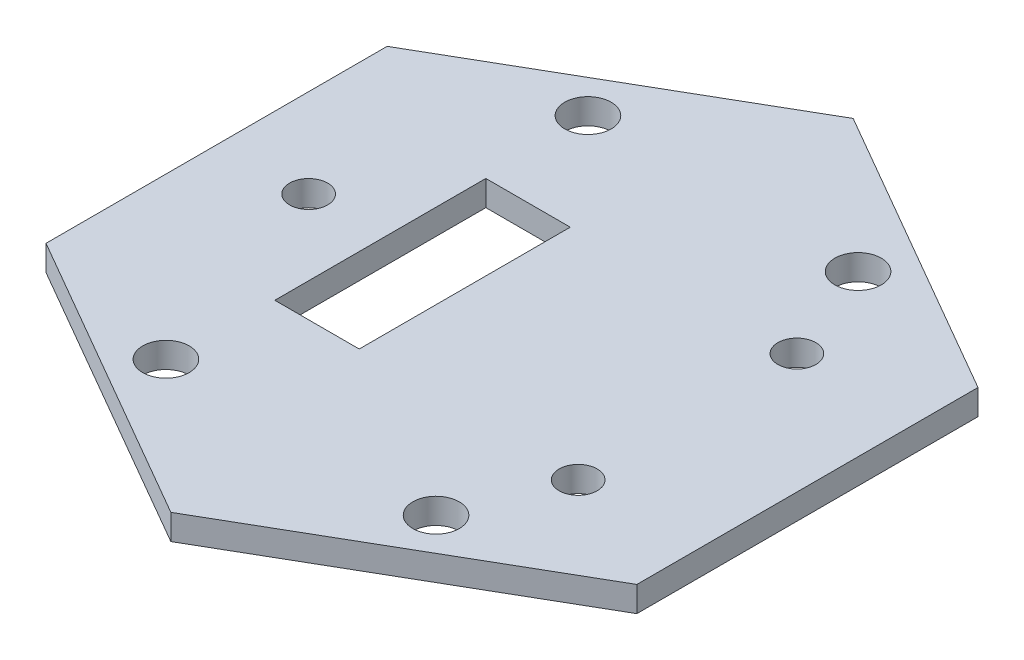
ISO-10303-21;
HEADER;
FILE_DESCRIPTION(('STEP AP214'),'2;1');
FILE_NAME('part.step','',(''),(''),'','','');
FILE_SCHEMA(('AUTOMOTIVE_DESIGN { 1 0 10303 214 1 1 1 1 }'));
ENDSEC;
DATA;
#1=APPLICATION_CONTEXT('core data for automotive mechanical design processes');
#2=APPLICATION_PROTOCOL_DEFINITION('international standard','automotive_design',2000,#1);
#3=PRODUCT_CONTEXT('',#1,'mechanical');
#4=PRODUCT('Part','Part','',(#3));
#5=PRODUCT_RELATED_PRODUCT_CATEGORY('part','',(#4));
#6=PRODUCT_DEFINITION_FORMATION('','',#4);
#7=PRODUCT_DEFINITION_CONTEXT('part definition',#1,'design');
#8=PRODUCT_DEFINITION('design','',#6,#7);
#9=PRODUCT_DEFINITION_SHAPE('','',#8);
#10=(LENGTH_UNIT() NAMED_UNIT(*) SI_UNIT(.MILLI.,.METRE.));
#11=(NAMED_UNIT(*) PLANE_ANGLE_UNIT() SI_UNIT($,.RADIAN.));
#12=(NAMED_UNIT(*) SI_UNIT($,.STERADIAN.) SOLID_ANGLE_UNIT());
#13=UNCERTAINTY_MEASURE_WITH_UNIT(LENGTH_MEASURE(1.E-05),#10,'distance_accuracy_value','');
#14=(GEOMETRIC_REPRESENTATION_CONTEXT(3) GLOBAL_UNCERTAINTY_ASSIGNED_CONTEXT((#13)) GLOBAL_UNIT_ASSIGNED_CONTEXT((#10,
#11,#12)) REPRESENTATION_CONTEXT('',''));
#15=CARTESIAN_POINT('',(0.,0.,0.));
#16=DIRECTION('',(0.,0.,1.));
#17=DIRECTION('',(1.,0.,0.));
#18=AXIS2_PLACEMENT_3D('',#15,#16,#17);
#19=CARTESIAN_POINT('',(-35.,3.,0.));
#20=DIRECTION('',(1.,0.,0.));
#21=DIRECTION('',(0.,0.,-1.));
#22=AXIS2_PLACEMENT_3D('',#19,#20,#21);
#23=PLANE('',#22);
#24=DIRECTION('',(0.,0.,1.));
#25=VECTOR('',#24,1.);
#26=CARTESIAN_POINT('',(-35.,0.,0.));
#27=LINE('',#26,#25);
#28=CARTESIAN_POINT('',(-35.,0.,-20.2072594216369));
#29=VERTEX_POINT('',#28);
#30=CARTESIAN_POINT('',(-35.,0.,20.2072594216369));
#31=VERTEX_POINT('',#30);
#32=EDGE_CURVE('E181',#29,#31,#27,.T.);
#33=ORIENTED_EDGE('',*,*,#32,.T.);
#34=DIRECTION('',(0.,-1.,0.));
#35=VECTOR('',#34,1.);
#36=CARTESIAN_POINT('',(-35.,3.,20.2072594216369));
#37=LINE('',#36,#35);
#38=CARTESIAN_POINT('',(-35.,3.,20.2072594216369));
#39=VERTEX_POINT('',#38);
#40=EDGE_CURVE('E11',#39,#31,#37,.T.);
#41=ORIENTED_EDGE('',*,*,#40,.F.);
#42=DIRECTION('',(0.,0.,1.));
#43=VECTOR('',#42,1.);
#44=CARTESIAN_POINT('',(-35.,3.,0.));
#45=LINE('',#44,#43);
#46=CARTESIAN_POINT('',(-35.,3.,-20.2072594216369));
#47=VERTEX_POINT('',#46);
#48=EDGE_CURVE('E294',#47,#39,#45,.T.);
#49=ORIENTED_EDGE('',*,*,#48,.F.);
#50=DIRECTION('',(0.,-1.,0.));
#51=VECTOR('',#50,1.);
#52=CARTESIAN_POINT('',(-35.,3.,-20.2072594216369));
#53=LINE('',#52,#51);
#54=EDGE_CURVE('E192',#47,#29,#53,.T.);
#55=ORIENTED_EDGE('',*,*,#54,.T.);
#56=EDGE_LOOP('',(#33,#41,#49,#55));
#57=FACE_BOUND('',#56,.T.);
#58=ADVANCED_FACE('F35',(#57),#23,.F.);
#59=CARTESIAN_POINT('',(-17.5,3.,30.3108891324554));
#60=DIRECTION('',(0.5,0.,-0.866025403784438));
#61=DIRECTION('',(-0.866025403784439,0.,-0.5));
#62=AXIS2_PLACEMENT_3D('',#59,#60,#61);
#63=PLANE('',#62);
#64=DIRECTION('',(0.866025403784439,0.,0.5));
#65=VECTOR('',#64,1.);
#66=CARTESIAN_POINT('',(-17.5,0.,30.3108891324554));
#67=LINE('',#66,#65);
#68=CARTESIAN_POINT('',(0.,0.,40.4145188432738));
#69=VERTEX_POINT('',#68);
#70=EDGE_CURVE('E184',#31,#69,#67,.T.);
#71=ORIENTED_EDGE('',*,*,#70,.T.);
#72=DIRECTION('',(0.,-1.,0.));
#73=VECTOR('',#72,1.);
#74=CARTESIAN_POINT('',(0.,3.,40.4145188432738));
#75=LINE('',#74,#73);
#76=CARTESIAN_POINT('',(0.,3.,40.4145188432738));
#77=VERTEX_POINT('',#76);
#78=EDGE_CURVE('E45',#77,#69,#75,.T.);
#79=ORIENTED_EDGE('',*,*,#78,.F.);
#80=DIRECTION('',(0.866025403784439,0.,0.5));
#81=VECTOR('',#80,1.);
#82=CARTESIAN_POINT('',(-17.5,3.,30.3108891324554));
#83=LINE('',#82,#81);
#84=EDGE_CURVE('E296',#39,#77,#83,.T.);
#85=ORIENTED_EDGE('',*,*,#84,.F.);
#86=ORIENTED_EDGE('',*,*,#40,.T.);
#87=EDGE_LOOP('',(#71,#79,#85,#86));
#88=FACE_BOUND('',#87,.T.);
#89=ADVANCED_FACE('F231',(#88),#63,.F.);
#90=CARTESIAN_POINT('',(17.5,3.,30.3108891324554));
#91=DIRECTION('',(-0.5,0.,-0.866025403784439));
#92=DIRECTION('',(-0.866025403784439,0.,0.5));
#93=AXIS2_PLACEMENT_3D('',#90,#91,#92);
#94=PLANE('',#93);
#95=DIRECTION('',(0.866025403784439,0.,-0.5));
#96=VECTOR('',#95,1.);
#97=CARTESIAN_POINT('',(17.5,0.,30.3108891324554));
#98=LINE('',#97,#96);
#99=CARTESIAN_POINT('',(35.,0.,20.2072594216369));
#100=VERTEX_POINT('',#99);
#101=EDGE_CURVE('E186',#69,#100,#98,.T.);
#102=ORIENTED_EDGE('',*,*,#101,.T.);
#103=DIRECTION('',(0.,-1.,0.));
#104=VECTOR('',#103,1.);
#105=CARTESIAN_POINT('',(35.,3.,20.2072594216369));
#106=LINE('',#105,#104);
#107=CARTESIAN_POINT('',(35.,3.,20.2072594216369));
#108=VERTEX_POINT('',#107);
#109=EDGE_CURVE('E139',#108,#100,#106,.T.);
#110=ORIENTED_EDGE('',*,*,#109,.F.);
#111=DIRECTION('',(0.866025403784439,0.,-0.5));
#112=VECTOR('',#111,1.);
#113=CARTESIAN_POINT('',(17.5,3.,30.3108891324554));
#114=LINE('',#113,#112);
#115=EDGE_CURVE('E130',#77,#108,#114,.T.);
#116=ORIENTED_EDGE('',*,*,#115,.F.);
#117=ORIENTED_EDGE('',*,*,#78,.T.);
#118=EDGE_LOOP('',(#102,#110,#116,#117));
#119=FACE_BOUND('',#118,.T.);
#120=ADVANCED_FACE('F237',(#119),#94,.F.);
#121=CARTESIAN_POINT('',(35.,3.,0.));
#122=DIRECTION('',(-1.,0.,0.));
#123=DIRECTION('',(0.,0.,1.));
#124=AXIS2_PLACEMENT_3D('',#121,#122,#123);
#125=PLANE('',#124);
#126=DIRECTION('',(0.,0.,-1.));
#127=VECTOR('',#126,1.);
#128=CARTESIAN_POINT('',(35.,0.,0.));
#129=LINE('',#128,#127);
#130=CARTESIAN_POINT('',(35.,0.,-20.2072594216369));
#131=VERTEX_POINT('',#130);
#132=EDGE_CURVE('E138',#100,#131,#129,.T.);
#133=ORIENTED_EDGE('',*,*,#132,.T.);
#134=DIRECTION('',(0.,-1.,0.));
#135=VECTOR('',#134,1.);
#136=CARTESIAN_POINT('',(35.,3.,-20.2072594216369));
#137=LINE('',#136,#135);
#138=CARTESIAN_POINT('',(35.,3.,-20.2072594216369));
#139=VERTEX_POINT('',#138);
#140=EDGE_CURVE('E135',#139,#131,#137,.T.);
#141=ORIENTED_EDGE('',*,*,#140,.F.);
#142=DIRECTION('',(0.,0.,-1.));
#143=VECTOR('',#142,1.);
#144=CARTESIAN_POINT('',(35.,3.,0.));
#145=LINE('',#144,#143);
#146=EDGE_CURVE('E124',#108,#139,#145,.T.);
#147=ORIENTED_EDGE('',*,*,#146,.F.);
#148=ORIENTED_EDGE('',*,*,#109,.T.);
#149=EDGE_LOOP('',(#133,#141,#147,#148));
#150=FACE_BOUND('',#149,.T.);
#151=ADVANCED_FACE('F136',(#150),#125,.F.);
#152=CARTESIAN_POINT('',(17.5,3.,-30.3108891324554));
#153=DIRECTION('',(-0.5,0.,0.866025403784439));
#154=DIRECTION('',(0.866025403784439,0.,0.5));
#155=AXIS2_PLACEMENT_3D('',#152,#153,#154);
#156=PLANE('',#155);
#157=DIRECTION('',(-0.866025403784439,0.,-0.5));
#158=VECTOR('',#157,1.);
#159=CARTESIAN_POINT('',(17.5,0.,-30.3108891324554));
#160=LINE('',#159,#158);
#161=CARTESIAN_POINT('',(0.,0.,-40.4145188432738));
#162=VERTEX_POINT('',#161);
#163=EDGE_CURVE('E89',#131,#162,#160,.T.);
#164=ORIENTED_EDGE('',*,*,#163,.T.);
#165=DIRECTION('',(0.,-1.,0.));
#166=VECTOR('',#165,1.);
#167=CARTESIAN_POINT('',(0.,3.,-40.4145188432738));
#168=LINE('',#167,#166);
#169=CARTESIAN_POINT('',(0.,3.,-40.4145188432738));
#170=VERTEX_POINT('',#169);
#171=EDGE_CURVE('E140',#170,#162,#168,.T.);
#172=ORIENTED_EDGE('',*,*,#171,.F.);
#173=DIRECTION('',(-0.866025403784439,0.,-0.5));
#174=VECTOR('',#173,1.);
#175=CARTESIAN_POINT('',(17.5,3.,-30.3108891324554));
#176=LINE('',#175,#174);
#177=EDGE_CURVE('E128',#139,#170,#176,.T.);
#178=ORIENTED_EDGE('',*,*,#177,.F.);
#179=ORIENTED_EDGE('',*,*,#140,.T.);
#180=EDGE_LOOP('',(#164,#172,#178,#179));
#181=FACE_BOUND('',#180,.T.);
#182=ADVANCED_FACE('F142',(#181),#156,.F.);
#183=CARTESIAN_POINT('',(0.,3.,-12.5));
#184=DIRECTION('',(0.,0.,-1.));
#185=DIRECTION('',(-1.,0.,0.));
#186=AXIS2_PLACEMENT_3D('',#183,#184,#185);
#187=PLANE('',#186);
#188=DIRECTION('',(1.,0.,0.));
#189=VECTOR('',#188,1.);
#190=CARTESIAN_POINT('',(0.,0.,-12.5));
#191=LINE('',#190,#189);
#192=CARTESIAN_POINT('',(-15.5993662410437,0.,-12.5));
#193=VERTEX_POINT('',#192);
#194=CARTESIAN_POINT('',(-5.59936624104365,0.,-12.5));
#195=VERTEX_POINT('',#194);
#196=EDGE_CURVE('E169',#193,#195,#191,.T.);
#197=ORIENTED_EDGE('',*,*,#196,.T.);
#198=DIRECTION('',(0.,-1.,0.));
#199=VECTOR('',#198,1.);
#200=CARTESIAN_POINT('',(-5.59936624104365,3.,-12.5));
#201=LINE('',#200,#199);
#202=CARTESIAN_POINT('',(-5.59936624104365,3.,-12.5));
#203=VERTEX_POINT('',#202);
#204=EDGE_CURVE('E39',#203,#195,#201,.T.);
#205=ORIENTED_EDGE('',*,*,#204,.F.);
#206=DIRECTION('',(1.,0.,0.));
#207=VECTOR('',#206,1.);
#208=CARTESIAN_POINT('',(0.,3.,-12.5));
#209=LINE('',#208,#207);
#210=CARTESIAN_POINT('',(-15.5993662410437,3.,-12.5));
#211=VERTEX_POINT('',#210);
#212=EDGE_CURVE('E285',#211,#203,#209,.T.);
#213=ORIENTED_EDGE('',*,*,#212,.F.);
#214=DIRECTION('',(0.,-1.,0.));
#215=VECTOR('',#214,1.);
#216=CARTESIAN_POINT('',(-15.5993662410437,3.,-12.5));
#217=LINE('',#216,#215);
#218=EDGE_CURVE('E144',#211,#193,#217,.T.);
#219=ORIENTED_EDGE('',*,*,#218,.T.);
#220=EDGE_LOOP('',(#197,#205,#213,#219));
#221=FACE_BOUND('',#220,.T.);
#222=ADVANCED_FACE('F209',(#221),#187,.F.);
#223=CARTESIAN_POINT('',(-5.59936624104365,3.,0.));
#224=DIRECTION('',(1.,0.,0.));
#225=DIRECTION('',(0.,0.,-1.));
#226=AXIS2_PLACEMENT_3D('',#223,#224,#225);
#227=PLANE('',#226);
#228=DIRECTION('',(0.,0.,1.));
#229=VECTOR('',#228,1.);
#230=CARTESIAN_POINT('',(-5.59936624104365,0.,0.));
#231=LINE('',#230,#229);
#232=CARTESIAN_POINT('',(-5.59936624104365,0.,12.5));
#233=VERTEX_POINT('',#232);
#234=EDGE_CURVE('E172',#195,#233,#231,.T.);
#235=ORIENTED_EDGE('',*,*,#234,.T.);
#236=DIRECTION('',(0.,-1.,0.));
#237=VECTOR('',#236,1.);
#238=CARTESIAN_POINT('',(-5.59936624104365,3.,12.5));
#239=LINE('',#238,#237);
#240=CARTESIAN_POINT('',(-5.59936624104365,3.,12.5));
#241=VERTEX_POINT('',#240);
#242=EDGE_CURVE('E200',#241,#233,#239,.T.);
#243=ORIENTED_EDGE('',*,*,#242,.F.);
#244=DIRECTION('',(0.,0.,1.));
#245=VECTOR('',#244,1.);
#246=CARTESIAN_POINT('',(-5.59936624104365,3.,0.));
#247=LINE('',#246,#245);
#248=EDGE_CURVE('E104',#203,#241,#247,.T.);
#249=ORIENTED_EDGE('',*,*,#248,.F.);
#250=ORIENTED_EDGE('',*,*,#204,.T.);
#251=EDGE_LOOP('',(#235,#243,#249,#250));
#252=FACE_BOUND('',#251,.T.);
#253=ADVANCED_FACE('F205',(#252),#227,.F.);
#254=CARTESIAN_POINT('',(0.,3.,12.5));
#255=DIRECTION('',(0.,0.,-1.));
#256=DIRECTION('',(-1.,0.,0.));
#257=AXIS2_PLACEMENT_3D('',#254,#255,#256);
#258=PLANE('',#257);
#259=DIRECTION('',(1.,0.,0.));
#260=VECTOR('',#259,1.);
#261=CARTESIAN_POINT('',(0.,0.,12.5));
#262=LINE('',#261,#260);
#263=CARTESIAN_POINT('',(-15.5993662410437,0.,12.5));
#264=VERTEX_POINT('',#263);
#265=EDGE_CURVE('E175',#264,#233,#262,.T.);
#266=ORIENTED_EDGE('',*,*,#265,.F.);
#267=DIRECTION('',(0.,-1.,0.));
#268=VECTOR('',#267,1.);
#269=CARTESIAN_POINT('',(-15.5993662410437,3.,12.5));
#270=LINE('',#269,#268);
#271=CARTESIAN_POINT('',(-15.5993662410437,3.,12.5));
#272=VERTEX_POINT('',#271);
#273=EDGE_CURVE('E199',#272,#264,#270,.T.);
#274=ORIENTED_EDGE('',*,*,#273,.F.);
#275=DIRECTION('',(1.,0.,0.));
#276=VECTOR('',#275,1.);
#277=CARTESIAN_POINT('',(0.,3.,12.5));
#278=LINE('',#277,#276);
#279=EDGE_CURVE('E287',#272,#241,#278,.T.);
#280=ORIENTED_EDGE('',*,*,#279,.T.);
#281=ORIENTED_EDGE('',*,*,#242,.T.);
#282=EDGE_LOOP('',(#266,#274,#280,#281));
#283=FACE_BOUND('',#282,.T.);
#284=ADVANCED_FACE('F220',(#283),#258,.T.);
#285=CARTESIAN_POINT('',(-15.5993662410437,3.,0.));
#286=DIRECTION('',(1.,0.,0.));
#287=DIRECTION('',(0.,0.,-1.));
#288=AXIS2_PLACEMENT_3D('',#285,#286,#287);
#289=PLANE('',#288);
#290=DIRECTION('',(0.,0.,1.));
#291=VECTOR('',#290,1.);
#292=CARTESIAN_POINT('',(-15.5993662410437,0.,0.));
#293=LINE('',#292,#291);
#294=EDGE_CURVE('E178',#193,#264,#293,.T.);
#295=ORIENTED_EDGE('',*,*,#294,.F.);
#296=ORIENTED_EDGE('',*,*,#218,.F.);
#297=DIRECTION('',(0.,0.,1.));
#298=VECTOR('',#297,1.);
#299=CARTESIAN_POINT('',(-15.5993662410437,3.,0.));
#300=LINE('',#299,#298);
#301=EDGE_CURVE('E218',#211,#272,#300,.T.);
#302=ORIENTED_EDGE('',*,*,#301,.T.);
#303=ORIENTED_EDGE('',*,*,#273,.T.);
#304=EDGE_LOOP('',(#295,#296,#302,#303));
#305=FACE_BOUND('',#304,.T.);
#306=ADVANCED_FACE('F215',(#305),#289,.T.);
#307=CARTESIAN_POINT('',(20.7926897580219,3.,-12.9581654807558));
#308=DIRECTION('',(0.,-1.,0.));
#309=DIRECTION('',(0.,0.,-1.));
#310=AXIS2_PLACEMENT_3D('',#307,#308,#309);
#311=CYLINDRICAL_SURFACE('',#310,2.25);
#312=CARTESIAN_POINT('',(20.7926897580219,3.,-12.9581654807558));
#313=DIRECTION('',(0.,1.,0.));
#314=DIRECTION('',(0.,0.,1.));
#315=AXIS2_PLACEMENT_3D('',#312,#313,#314);
#316=CIRCLE('',#315,2.25);
#317=CARTESIAN_POINT('',(20.7926897580219,3.,-10.7081654807558));
#318=VERTEX_POINT('',#317);
#319=EDGE_CURVE('E284',#318,#318,#316,.T.);
#320=ORIENTED_EDGE('',*,*,#319,.T.);
#321=EDGE_LOOP('',(#320));
#322=FACE_BOUND('',#321,.T.);
#323=CARTESIAN_POINT('',(20.7926897580219,0.,-12.9581654807558));
#324=DIRECTION('',(0.,1.,0.));
#325=DIRECTION('',(0.,0.,1.));
#326=AXIS2_PLACEMENT_3D('',#323,#324,#325);
#327=CIRCLE('',#326,2.25);
#328=CARTESIAN_POINT('',(20.7926897580219,0.,-10.7081654807558));
#329=VERTEX_POINT('',#328);
#330=EDGE_CURVE('E166',#329,#329,#327,.T.);
#331=ORIENTED_EDGE('',*,*,#330,.F.);
#332=EDGE_LOOP('',(#331));
#333=FACE_BOUND('',#332,.T.);
#334=ADVANCED_FACE('F227',(#322,#333),#311,.F.);
#335=CARTESIAN_POINT('',(20.7943926151757,3.,12.9554326738217));
#336=DIRECTION('',(0.,-1.,0.));
#337=DIRECTION('',(0.,0.,-1.));
#338=AXIS2_PLACEMENT_3D('',#335,#336,#337);
#339=CYLINDRICAL_SURFACE('',#338,2.25000000000001);
#340=CARTESIAN_POINT('',(20.7943926151757,3.,12.9554326738217));
#341=DIRECTION('',(0.,1.,0.));
#342=DIRECTION('',(0.,0.,1.));
#343=AXIS2_PLACEMENT_3D('',#340,#341,#342);
#344=CIRCLE('',#343,2.25000000000001);
#345=CARTESIAN_POINT('',(20.7943926151757,3.,15.2054326738217));
#346=VERTEX_POINT('',#345);
#347=EDGE_CURVE('E280',#346,#346,#344,.T.);
#348=ORIENTED_EDGE('',*,*,#347,.T.);
#349=EDGE_LOOP('',(#348));
#350=FACE_BOUND('',#349,.T.);
#351=CARTESIAN_POINT('',(20.7943926151757,0.,12.9554326738217));
#352=DIRECTION('',(0.,1.,0.));
#353=DIRECTION('',(0.,0.,1.));
#354=AXIS2_PLACEMENT_3D('',#351,#352,#353);
#355=CIRCLE('',#354,2.25000000000001);
#356=CARTESIAN_POINT('',(20.7943926151757,0.,15.2054326738217));
#357=VERTEX_POINT('',#356);
#358=EDGE_CURVE('E163',#357,#357,#355,.T.);
#359=ORIENTED_EDGE('',*,*,#358,.F.);
#360=EDGE_LOOP('',(#359));
#361=FACE_BOUND('',#360,.T.);
#362=ADVANCED_FACE('F326',(#350,#361),#339,.F.);
#363=CARTESIAN_POINT('',(-24.5,3.,-0.406188595997093));
#364=DIRECTION('',(0.,-1.,0.));
#365=DIRECTION('',(0.,0.,-1.));
#366=AXIS2_PLACEMENT_3D('',#363,#364,#365);
#367=CYLINDRICAL_SURFACE('',#366,2.25);
#368=CARTESIAN_POINT('',(-24.5,3.,-0.406188595997093));
#369=DIRECTION('',(0.,1.,0.));
#370=DIRECTION('',(0.,0.,1.));
#371=AXIS2_PLACEMENT_3D('',#368,#369,#370);
#372=CIRCLE('',#371,2.25);
#373=CARTESIAN_POINT('',(-24.5,3.,1.84381140400291));
#374=VERTEX_POINT('',#373);
#375=EDGE_CURVE('E276',#374,#374,#372,.T.);
#376=ORIENTED_EDGE('',*,*,#375,.T.);
#377=EDGE_LOOP('',(#376));
#378=FACE_BOUND('',#377,.T.);
#379=CARTESIAN_POINT('',(-24.5,0.,-0.406188595997093));
#380=DIRECTION('',(0.,1.,0.));
#381=DIRECTION('',(0.,0.,1.));
#382=AXIS2_PLACEMENT_3D('',#379,#380,#381);
#383=CIRCLE('',#382,2.25);
#384=CARTESIAN_POINT('',(-24.5,0.,1.84381140400291));
#385=VERTEX_POINT('',#384);
#386=EDGE_CURVE('E160',#385,#385,#383,.T.);
#387=ORIENTED_EDGE('',*,*,#386,.F.);
#388=EDGE_LOOP('',(#387));
#389=FACE_BOUND('',#388,.T.);
#390=ADVANCED_FACE('F332',(#378,#389),#367,.F.);
#391=CARTESIAN_POINT('',(-16.,3.,-25.));
#392=DIRECTION('',(0.,-1.,0.));
#393=DIRECTION('',(0.,0.,-1.));
#394=AXIS2_PLACEMENT_3D('',#391,#392,#393);
#395=CYLINDRICAL_SURFACE('',#394,2.75);
#396=CARTESIAN_POINT('',(-16.,3.,-25.));
#397=DIRECTION('',(0.,1.,0.));
#398=DIRECTION('',(0.,0.,1.));
#399=AXIS2_PLACEMENT_3D('',#396,#397,#398);
#400=CIRCLE('',#399,2.75);
#401=CARTESIAN_POINT('',(-16.,3.,-22.25));
#402=VERTEX_POINT('',#401);
#403=EDGE_CURVE('E272',#402,#402,#400,.T.);
#404=ORIENTED_EDGE('',*,*,#403,.T.);
#405=EDGE_LOOP('',(#404));
#406=FACE_BOUND('',#405,.T.);
#407=CARTESIAN_POINT('',(-16.,0.,-25.));
#408=DIRECTION('',(0.,1.,0.));
#409=DIRECTION('',(0.,0.,1.));
#410=AXIS2_PLACEMENT_3D('',#407,#408,#409);
#411=CIRCLE('',#410,2.75);
#412=CARTESIAN_POINT('',(-16.,0.,-22.25));
#413=VERTEX_POINT('',#412);
#414=EDGE_CURVE('E157',#413,#413,#411,.T.);
#415=ORIENTED_EDGE('',*,*,#414,.F.);
#416=EDGE_LOOP('',(#415));
#417=FACE_BOUND('',#416,.T.);
#418=ADVANCED_FACE('F339',(#406,#417),#395,.F.);
#419=CARTESIAN_POINT('',(16.,3.,-25.));
#420=DIRECTION('',(0.,-1.,0.));
#421=DIRECTION('',(0.,0.,-1.));
#422=AXIS2_PLACEMENT_3D('',#419,#420,#421);
#423=CYLINDRICAL_SURFACE('',#422,2.75);
#424=CARTESIAN_POINT('',(16.,3.,-25.));
#425=DIRECTION('',(0.,1.,0.));
#426=DIRECTION('',(0.,0.,1.));
#427=AXIS2_PLACEMENT_3D('',#424,#425,#426);
#428=CIRCLE('',#427,2.75);
#429=CARTESIAN_POINT('',(16.,3.,-22.25));
#430=VERTEX_POINT('',#429);
#431=EDGE_CURVE('E268',#430,#430,#428,.T.);
#432=ORIENTED_EDGE('',*,*,#431,.T.);
#433=EDGE_LOOP('',(#432));
#434=FACE_BOUND('',#433,.T.);
#435=CARTESIAN_POINT('',(16.,0.,-25.));
#436=DIRECTION('',(0.,1.,0.));
#437=DIRECTION('',(0.,0.,1.));
#438=AXIS2_PLACEMENT_3D('',#435,#436,#437);
#439=CIRCLE('',#438,2.75);
#440=CARTESIAN_POINT('',(16.,0.,-22.25));
#441=VERTEX_POINT('',#440);
#442=EDGE_CURVE('E154',#441,#441,#439,.T.);
#443=ORIENTED_EDGE('',*,*,#442,.F.);
#444=EDGE_LOOP('',(#443));
#445=FACE_BOUND('',#444,.T.);
#446=ADVANCED_FACE('F343',(#434,#445),#423,.F.);
#447=CARTESIAN_POINT('',(-16.,3.,25.));
#448=DIRECTION('',(0.,-1.,0.));
#449=DIRECTION('',(0.,0.,-1.));
#450=AXIS2_PLACEMENT_3D('',#447,#448,#449);
#451=CYLINDRICAL_SURFACE('',#450,2.75);
#452=CARTESIAN_POINT('',(-16.,3.,25.));
#453=DIRECTION('',(0.,1.,0.));
#454=DIRECTION('',(0.,0.,1.));
#455=AXIS2_PLACEMENT_3D('',#452,#453,#454);
#456=CIRCLE('',#455,2.75);
#457=CARTESIAN_POINT('',(-16.,3.,27.75));
#458=VERTEX_POINT('',#457);
#459=EDGE_CURVE('E264',#458,#458,#456,.T.);
#460=ORIENTED_EDGE('',*,*,#459,.T.);
#461=EDGE_LOOP('',(#460));
#462=FACE_BOUND('',#461,.T.);
#463=CARTESIAN_POINT('',(-16.,0.,25.));
#464=DIRECTION('',(0.,1.,0.));
#465=DIRECTION('',(0.,0.,1.));
#466=AXIS2_PLACEMENT_3D('',#463,#464,#465);
#467=CIRCLE('',#466,2.75);
#468=CARTESIAN_POINT('',(-16.,0.,27.75));
#469=VERTEX_POINT('',#468);
#470=EDGE_CURVE('E151',#469,#469,#467,.T.);
#471=ORIENTED_EDGE('',*,*,#470,.F.);
#472=EDGE_LOOP('',(#471));
#473=FACE_BOUND('',#472,.T.);
#474=ADVANCED_FACE('F310',(#462,#473),#451,.F.);
#475=CARTESIAN_POINT('',(16.,3.,25.));
#476=DIRECTION('',(0.,-1.,0.));
#477=DIRECTION('',(0.,0.,-1.));
#478=AXIS2_PLACEMENT_3D('',#475,#476,#477);
#479=CYLINDRICAL_SURFACE('',#478,2.75);
#480=CARTESIAN_POINT('',(16.,3.,25.));
#481=DIRECTION('',(0.,1.,0.));
#482=DIRECTION('',(0.,0.,1.));
#483=AXIS2_PLACEMENT_3D('',#480,#481,#482);
#484=CIRCLE('',#483,2.75);
#485=CARTESIAN_POINT('',(16.,3.,27.75));
#486=VERTEX_POINT('',#485);
#487=EDGE_CURVE('E191',#486,#486,#484,.T.);
#488=ORIENTED_EDGE('',*,*,#487,.T.);
#489=EDGE_LOOP('',(#488));
#490=FACE_BOUND('',#489,.T.);
#491=CARTESIAN_POINT('',(16.,0.,25.));
#492=DIRECTION('',(0.,1.,0.));
#493=DIRECTION('',(0.,0.,1.));
#494=AXIS2_PLACEMENT_3D('',#491,#492,#493);
#495=CIRCLE('',#494,2.75);
#496=CARTESIAN_POINT('',(16.,0.,27.75));
#497=VERTEX_POINT('',#496);
#498=EDGE_CURVE('E148',#497,#497,#495,.T.);
#499=ORIENTED_EDGE('',*,*,#498,.F.);
#500=EDGE_LOOP('',(#499));
#501=FACE_BOUND('',#500,.T.);
#502=ADVANCED_FACE('F37',(#490,#501),#479,.F.);
#503=CARTESIAN_POINT('',(-17.5,3.,-30.3108891324554));
#504=DIRECTION('',(0.5,0.,0.866025403784439));
#505=DIRECTION('',(0.866025403784439,0.,-0.5));
#506=AXIS2_PLACEMENT_3D('',#503,#504,#505);
#507=PLANE('',#506);
#508=DIRECTION('',(-0.866025403784439,0.,0.5));
#509=VECTOR('',#508,1.);
#510=CARTESIAN_POINT('',(-17.5,0.,-30.3108891324554));
#511=LINE('',#510,#509);
#512=EDGE_CURVE('E95',#162,#29,#511,.T.);
#513=ORIENTED_EDGE('',*,*,#512,.T.);
#514=ORIENTED_EDGE('',*,*,#54,.F.);
#515=DIRECTION('',(-0.866025403784439,0.,0.5));
#516=VECTOR('',#515,1.);
#517=CARTESIAN_POINT('',(-17.5,3.,-30.3108891324554));
#518=LINE('',#517,#516);
#519=EDGE_CURVE('E54',#170,#47,#518,.T.);
#520=ORIENTED_EDGE('',*,*,#519,.F.);
#521=ORIENTED_EDGE('',*,*,#171,.T.);
#522=EDGE_LOOP('',(#513,#514,#520,#521));
#523=FACE_BOUND('',#522,.T.);
#524=ADVANCED_FACE('F248',(#523),#507,.F.);
#525=CARTESIAN_POINT('',(0.,3.,0.));
#526=DIRECTION('',(0.,1.,0.));
#527=DIRECTION('',(0.,0.,1.));
#528=AXIS2_PLACEMENT_3D('',#525,#526,#527);
#529=PLANE('',#528);
#530=ORIENTED_EDGE('',*,*,#487,.F.);
#531=EDGE_LOOP('',(#530));
#532=FACE_BOUND('',#531,.T.);
#533=ORIENTED_EDGE('',*,*,#459,.F.);
#534=EDGE_LOOP('',(#533));
#535=FACE_BOUND('',#534,.T.);
#536=ORIENTED_EDGE('',*,*,#431,.F.);
#537=EDGE_LOOP('',(#536));
#538=FACE_BOUND('',#537,.T.);
#539=ORIENTED_EDGE('',*,*,#403,.F.);
#540=EDGE_LOOP('',(#539));
#541=FACE_BOUND('',#540,.T.);
#542=ORIENTED_EDGE('',*,*,#375,.F.);
#543=EDGE_LOOP('',(#542));
#544=FACE_BOUND('',#543,.T.);
#545=ORIENTED_EDGE('',*,*,#347,.F.);
#546=EDGE_LOOP('',(#545));
#547=FACE_BOUND('',#546,.T.);
#548=ORIENTED_EDGE('',*,*,#319,.F.);
#549=EDGE_LOOP('',(#548));
#550=FACE_BOUND('',#549,.T.);
#551=ORIENTED_EDGE('',*,*,#212,.T.);
#552=ORIENTED_EDGE('',*,*,#248,.T.);
#553=ORIENTED_EDGE('',*,*,#279,.F.);
#554=ORIENTED_EDGE('',*,*,#301,.F.);
#555=EDGE_LOOP('',(#551,#552,#553,#554));
#556=FACE_BOUND('',#555,.T.);
#557=ORIENTED_EDGE('',*,*,#48,.T.);
#558=ORIENTED_EDGE('',*,*,#84,.T.);
#559=ORIENTED_EDGE('',*,*,#115,.T.);
#560=ORIENTED_EDGE('',*,*,#146,.T.);
#561=ORIENTED_EDGE('',*,*,#177,.T.);
#562=ORIENTED_EDGE('',*,*,#519,.T.);
#563=EDGE_LOOP('',(#557,#558,#559,#560,#561,#562));
#564=FACE_BOUND('',#563,.T.);
#565=ADVANCED_FACE('F126',(#532,#535,#538,#541,#544,#547,#550,#556,#564),#529,.T.);
#566=CARTESIAN_POINT('',(0.,0.,0.));
#567=DIRECTION('',(0.,1.,0.));
#568=DIRECTION('',(0.,0.,1.));
#569=AXIS2_PLACEMENT_3D('',#566,#567,#568);
#570=PLANE('',#569);
#571=ORIENTED_EDGE('',*,*,#498,.T.);
#572=EDGE_LOOP('',(#571));
#573=FACE_BOUND('',#572,.T.);
#574=ORIENTED_EDGE('',*,*,#470,.T.);
#575=EDGE_LOOP('',(#574));
#576=FACE_BOUND('',#575,.T.);
#577=ORIENTED_EDGE('',*,*,#442,.T.);
#578=EDGE_LOOP('',(#577));
#579=FACE_BOUND('',#578,.T.);
#580=ORIENTED_EDGE('',*,*,#414,.T.);
#581=EDGE_LOOP('',(#580));
#582=FACE_BOUND('',#581,.T.);
#583=ORIENTED_EDGE('',*,*,#386,.T.);
#584=EDGE_LOOP('',(#583));
#585=FACE_BOUND('',#584,.T.);
#586=ORIENTED_EDGE('',*,*,#358,.T.);
#587=EDGE_LOOP('',(#586));
#588=FACE_BOUND('',#587,.T.);
#589=ORIENTED_EDGE('',*,*,#330,.T.);
#590=EDGE_LOOP('',(#589));
#591=FACE_BOUND('',#590,.T.);
#592=ORIENTED_EDGE('',*,*,#196,.F.);
#593=ORIENTED_EDGE('',*,*,#294,.T.);
#594=ORIENTED_EDGE('',*,*,#265,.T.);
#595=ORIENTED_EDGE('',*,*,#234,.F.);
#596=EDGE_LOOP('',(#592,#593,#594,#595));
#597=FACE_BOUND('',#596,.T.);
#598=ORIENTED_EDGE('',*,*,#32,.F.);
#599=ORIENTED_EDGE('',*,*,#512,.F.);
#600=ORIENTED_EDGE('',*,*,#163,.F.);
#601=ORIENTED_EDGE('',*,*,#132,.F.);
#602=ORIENTED_EDGE('',*,*,#101,.F.);
#603=ORIENTED_EDGE('',*,*,#70,.F.);
#604=EDGE_LOOP('',(#598,#599,#600,#601,#602,#603));
#605=FACE_BOUND('',#604,.T.);
#606=ADVANCED_FACE('F212',(#573,#576,#579,#582,#585,#588,#591,#597,#605),#570,.F.);
#607=CLOSED_SHELL('',(#58,#89,#120,#151,#182,#222,#253,#284,#306,#334,#362,#390,#418,#446,#474,
#502,#524,#565,#606));
#608=MANIFOLD_SOLID_BREP('B2',#607);
#609=ADVANCED_BREP_SHAPE_REPRESENTATION('',(#18,#608),#14);
#610=SHAPE_DEFINITION_REPRESENTATION(#9,#609);
ENDSEC;
END-ISO-10303-21;
